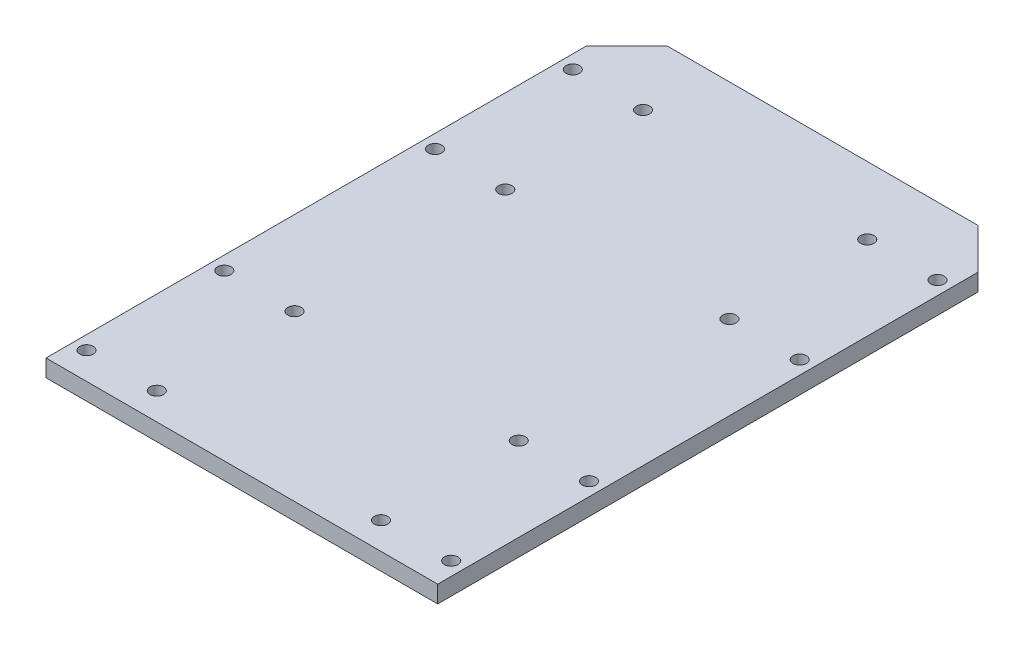
ISO-10303-21;
HEADER;
FILE_DESCRIPTION(('STEP AP214'),'2;1');
FILE_NAME('part.step','',(''),(''),'','','');
FILE_SCHEMA(('AUTOMOTIVE_DESIGN { 1 0 10303 214 1 1 1 1 }'));
ENDSEC;
DATA;
#1=APPLICATION_CONTEXT('core data for automotive mechanical design processes');
#2=APPLICATION_PROTOCOL_DEFINITION('international standard','automotive_design',2000,#1);
#3=PRODUCT_CONTEXT('',#1,'mechanical');
#4=PRODUCT('Part','Part','',(#3));
#5=PRODUCT_RELATED_PRODUCT_CATEGORY('part','',(#4));
#6=PRODUCT_DEFINITION_FORMATION('','',#4);
#7=PRODUCT_DEFINITION_CONTEXT('part definition',#1,'design');
#8=PRODUCT_DEFINITION('design','',#6,#7);
#9=PRODUCT_DEFINITION_SHAPE('','',#8);
#10=(LENGTH_UNIT() NAMED_UNIT(*) SI_UNIT(.MILLI.,.METRE.));
#11=(NAMED_UNIT(*) PLANE_ANGLE_UNIT() SI_UNIT($,.RADIAN.));
#12=(NAMED_UNIT(*) SI_UNIT($,.STERADIAN.) SOLID_ANGLE_UNIT());
#13=UNCERTAINTY_MEASURE_WITH_UNIT(LENGTH_MEASURE(1.E-05),#10,'distance_accuracy_value','');
#14=(GEOMETRIC_REPRESENTATION_CONTEXT(3) GLOBAL_UNCERTAINTY_ASSIGNED_CONTEXT((#13)) GLOBAL_UNIT_ASSIGNED_CONTEXT((#10,
#11,#12)) REPRESENTATION_CONTEXT('',''));
#15=CARTESIAN_POINT('',(0.,0.,0.));
#16=DIRECTION('',(0.,0.,1.));
#17=DIRECTION('',(1.,0.,0.));
#18=AXIS2_PLACEMENT_3D('',#15,#16,#17);
#19=CARTESIAN_POINT('',(-145.,6.35,0.));
#20=DIRECTION('',(-1.,0.,0.));
#21=DIRECTION('',(0.,0.,1.));
#22=AXIS2_PLACEMENT_3D('',#19,#20,#21);
#23=PLANE('',#22);
#24=DIRECTION('',(0.,0.,-1.));
#25=VECTOR('',#24,1.);
#26=CARTESIAN_POINT('',(-145.,0.,0.));
#27=LINE('',#26,#25);
#28=CARTESIAN_POINT('',(-145.,0.,0.));
#29=VERTEX_POINT('',#28);
#30=CARTESIAN_POINT('',(-145.,0.,-200.));
#31=VERTEX_POINT('',#30);
#32=EDGE_CURVE('E193',#29,#31,#27,.T.);
#33=ORIENTED_EDGE('',*,*,#32,.F.);
#34=DIRECTION('',(0.,-1.,0.));
#35=VECTOR('',#34,1.);
#36=CARTESIAN_POINT('',(-145.,6.35,0.));
#37=LINE('',#36,#35);
#38=CARTESIAN_POINT('',(-145.,6.35,0.));
#39=VERTEX_POINT('',#38);
#40=EDGE_CURVE('E11',#39,#29,#37,.T.);
#41=ORIENTED_EDGE('',*,*,#40,.F.);
#42=DIRECTION('',(0.,0.,-1.));
#43=VECTOR('',#42,1.);
#44=CARTESIAN_POINT('',(-145.,6.35,0.));
#45=LINE('',#44,#43);
#46=CARTESIAN_POINT('',(-145.,6.35,-200.));
#47=VERTEX_POINT('',#46);
#48=EDGE_CURVE('E574',#39,#47,#45,.T.);
#49=ORIENTED_EDGE('',*,*,#48,.T.);
#50=DIRECTION('',(0.,-1.,0.));
#51=VECTOR('',#50,1.);
#52=CARTESIAN_POINT('',(-145.,6.35,-200.));
#53=LINE('',#52,#51);
#54=EDGE_CURVE('E59',#47,#31,#53,.T.);
#55=ORIENTED_EDGE('',*,*,#54,.T.);
#56=EDGE_LOOP('',(#33,#41,#49,#55));
#57=FACE_BOUND('',#56,.T.);
#58=ADVANCED_FACE('F41',(#57),#23,.T.);
#59=CARTESIAN_POINT('',(0.,6.35,0.));
#60=DIRECTION('',(0.,0.,1.));
#61=DIRECTION('',(1.,0.,0.));
#62=AXIS2_PLACEMENT_3D('',#59,#60,#61);
#63=PLANE('',#62);
#64=DIRECTION('',(-1.,0.,0.));
#65=VECTOR('',#64,1.);
#66=CARTESIAN_POINT('',(0.,0.,0.));
#67=LINE('',#66,#65);
#68=CARTESIAN_POINT('',(0.,0.,0.));
#69=VERTEX_POINT('',#68);
#70=EDGE_CURVE('E196',#69,#29,#67,.T.);
#71=ORIENTED_EDGE('',*,*,#70,.F.);
#72=DIRECTION('',(0.,-1.,0.));
#73=VECTOR('',#72,1.);
#74=CARTESIAN_POINT('',(0.,6.35,0.));
#75=LINE('',#74,#73);
#76=CARTESIAN_POINT('',(0.,6.35,0.));
#77=VERTEX_POINT('',#76);
#78=EDGE_CURVE('E51',#77,#69,#75,.T.);
#79=ORIENTED_EDGE('',*,*,#78,.F.);
#80=DIRECTION('',(-1.,0.,0.));
#81=VECTOR('',#80,1.);
#82=CARTESIAN_POINT('',(0.,6.35,0.));
#83=LINE('',#82,#81);
#84=EDGE_CURVE('E246',#77,#39,#83,.T.);
#85=ORIENTED_EDGE('',*,*,#84,.T.);
#86=ORIENTED_EDGE('',*,*,#40,.T.);
#87=EDGE_LOOP('',(#71,#79,#85,#86));
#88=FACE_BOUND('',#87,.T.);
#89=ADVANCED_FACE('F245',(#88),#63,.T.);
#90=CARTESIAN_POINT('',(0.,6.35,0.));
#91=DIRECTION('',(-1.,0.,0.));
#92=DIRECTION('',(0.,0.,1.));
#93=AXIS2_PLACEMENT_3D('',#90,#91,#92);
#94=PLANE('',#93);
#95=DIRECTION('',(0.,0.,-1.));
#96=VECTOR('',#95,1.);
#97=CARTESIAN_POINT('',(0.,0.,0.));
#98=LINE('',#97,#96);
#99=CARTESIAN_POINT('',(0.,0.,-200.));
#100=VERTEX_POINT('',#99);
#101=EDGE_CURVE('E200',#69,#100,#98,.T.);
#102=ORIENTED_EDGE('',*,*,#101,.T.);
#103=DIRECTION('',(0.,-1.,0.));
#104=VECTOR('',#103,1.);
#105=CARTESIAN_POINT('',(0.,6.35,-200.));
#106=LINE('',#105,#104);
#107=CARTESIAN_POINT('',(0.,6.35,-200.));
#108=VERTEX_POINT('',#107);
#109=EDGE_CURVE('E107',#108,#100,#106,.T.);
#110=ORIENTED_EDGE('',*,*,#109,.F.);
#111=DIRECTION('',(0.,0.,-1.));
#112=VECTOR('',#111,1.);
#113=CARTESIAN_POINT('',(0.,6.35,0.));
#114=LINE('',#113,#112);
#115=EDGE_CURVE('E117',#77,#108,#114,.T.);
#116=ORIENTED_EDGE('',*,*,#115,.F.);
#117=ORIENTED_EDGE('',*,*,#78,.T.);
#118=EDGE_LOOP('',(#102,#110,#116,#117));
#119=FACE_BOUND('',#118,.T.);
#120=ADVANCED_FACE('F238',(#119),#94,.F.);
#121=CARTESIAN_POINT('',(100.,6.35,-100.000000000001));
#122=DIRECTION('',(0.707106781186542,0.,-0.707106781186552));
#123=DIRECTION('',(-0.707106781186552,0.,-0.707106781186543));
#124=AXIS2_PLACEMENT_3D('',#121,#122,#123);
#125=PLANE('',#124);
#126=DIRECTION('',(0.707106781186552,0.,0.707106781186543));
#127=VECTOR('',#126,1.);
#128=CARTESIAN_POINT('',(100.,0.,-100.000000000001));
#129=LINE('',#128,#127);
#130=CARTESIAN_POINT('',(-15.0000000000002,0.,-215.));
#131=VERTEX_POINT('',#130);
#132=EDGE_CURVE('E102',#131,#100,#129,.T.);
#133=ORIENTED_EDGE('',*,*,#132,.F.);
#134=DIRECTION('',(0.,-1.,0.));
#135=VECTOR('',#134,1.);
#136=CARTESIAN_POINT('',(-15.0000000000002,6.35,-215.));
#137=LINE('',#136,#135);
#138=CARTESIAN_POINT('',(-15.0000000000002,6.35,-215.));
#139=VERTEX_POINT('',#138);
#140=EDGE_CURVE('E97',#139,#131,#137,.T.);
#141=ORIENTED_EDGE('',*,*,#140,.F.);
#142=DIRECTION('',(0.707106781186552,0.,0.707106781186543));
#143=VECTOR('',#142,1.);
#144=CARTESIAN_POINT('',(100.,6.35,-100.000000000001));
#145=LINE('',#144,#143);
#146=EDGE_CURVE('E100',#139,#108,#145,.T.);
#147=ORIENTED_EDGE('',*,*,#146,.T.);
#148=ORIENTED_EDGE('',*,*,#109,.T.);
#149=EDGE_LOOP('',(#133,#141,#147,#148));
#150=FACE_BOUND('',#149,.T.);
#151=ADVANCED_FACE('F99',(#150),#125,.T.);
#152=CARTESIAN_POINT('',(-1.55672576278963E-13,6.35,-215.));
#153=DIRECTION('',(0.,0.,-1.));
#154=DIRECTION('',(-1.,0.,0.));
#155=AXIS2_PLACEMENT_3D('',#152,#153,#154);
#156=PLANE('',#155);
#157=DIRECTION('',(1.,0.,0.));
#158=VECTOR('',#157,1.);
#159=CARTESIAN_POINT('',(-1.55672576278963E-13,0.,-215.));
#160=LINE('',#159,#158);
#161=CARTESIAN_POINT('',(-130.,0.,-215.));
#162=VERTEX_POINT('',#161);
#163=EDGE_CURVE('E206',#162,#131,#160,.T.);
#164=ORIENTED_EDGE('',*,*,#163,.F.);
#165=DIRECTION('',(0.,-1.,0.));
#166=VECTOR('',#165,1.);
#167=CARTESIAN_POINT('',(-130.,6.35,-215.));
#168=LINE('',#167,#166);
#169=CARTESIAN_POINT('',(-130.,6.35,-215.));
#170=VERTEX_POINT('',#169);
#171=EDGE_CURVE('E78',#170,#162,#168,.T.);
#172=ORIENTED_EDGE('',*,*,#171,.F.);
#173=DIRECTION('',(1.,0.,0.));
#174=VECTOR('',#173,1.);
#175=CARTESIAN_POINT('',(-1.55672576278963E-13,6.35,-215.));
#176=LINE('',#175,#174);
#177=EDGE_CURVE('E114',#170,#139,#176,.T.);
#178=ORIENTED_EDGE('',*,*,#177,.T.);
#179=ORIENTED_EDGE('',*,*,#140,.T.);
#180=EDGE_LOOP('',(#164,#172,#178,#179));
#181=FACE_BOUND('',#180,.T.);
#182=ADVANCED_FACE('F121',(#181),#156,.T.);
#183=CARTESIAN_POINT('',(-114.,6.35,-61.));
#184=DIRECTION('',(0.,-1.,0.));
#185=DIRECTION('',(0.,0.,-1.));
#186=AXIS2_PLACEMENT_3D('',#183,#184,#185);
#187=CYLINDRICAL_SURFACE('',#186,2.5);
#188=CARTESIAN_POINT('',(-114.,6.35,-61.));
#189=DIRECTION('',(0.,1.,0.));
#190=DIRECTION('',(0.,0.,1.));
#191=AXIS2_PLACEMENT_3D('',#188,#189,#190);
#192=CIRCLE('',#191,2.5);
#193=CARTESIAN_POINT('',(-114.,6.35,-58.5));
#194=VERTEX_POINT('',#193);
#195=EDGE_CURVE('E137',#194,#194,#192,.F.);
#196=ORIENTED_EDGE('',*,*,#195,.F.);
#197=EDGE_LOOP('',(#196));
#198=FACE_BOUND('',#197,.T.);
#199=CARTESIAN_POINT('',(-114.,0.,-61.));
#200=DIRECTION('',(0.,1.,0.));
#201=DIRECTION('',(0.,0.,1.));
#202=AXIS2_PLACEMENT_3D('',#199,#200,#201);
#203=CIRCLE('',#202,2.5);
#204=CARTESIAN_POINT('',(-114.,0.,-58.5));
#205=VERTEX_POINT('',#204);
#206=EDGE_CURVE('E221',#205,#205,#203,.F.);
#207=ORIENTED_EDGE('',*,*,#206,.T.);
#208=EDGE_LOOP('',(#207));
#209=FACE_BOUND('',#208,.T.);
#210=ADVANCED_FACE('F362',(#198,#209),#187,.F.);
#211=CARTESIAN_POINT('',(-31.,6.35,-139.));
#212=DIRECTION('',(0.,-1.,0.));
#213=DIRECTION('',(0.,0.,-1.));
#214=AXIS2_PLACEMENT_3D('',#211,#212,#213);
#215=CYLINDRICAL_SURFACE('',#214,2.5);
#216=CARTESIAN_POINT('',(-31.,6.35,-139.));
#217=DIRECTION('',(0.,1.,0.));
#218=DIRECTION('',(0.,0.,1.));
#219=AXIS2_PLACEMENT_3D('',#216,#217,#218);
#220=CIRCLE('',#219,2.5);
#221=CARTESIAN_POINT('',(-31.,6.35,-136.5));
#222=VERTEX_POINT('',#221);
#223=EDGE_CURVE('E133',#222,#222,#220,.F.);
#224=ORIENTED_EDGE('',*,*,#223,.F.);
#225=EDGE_LOOP('',(#224));
#226=FACE_BOUND('',#225,.T.);
#227=CARTESIAN_POINT('',(-31.,0.,-139.));
#228=DIRECTION('',(0.,1.,0.));
#229=DIRECTION('',(0.,0.,1.));
#230=AXIS2_PLACEMENT_3D('',#227,#228,#229);
#231=CIRCLE('',#230,2.5);
#232=CARTESIAN_POINT('',(-31.,0.,-136.5));
#233=VERTEX_POINT('',#232);
#234=EDGE_CURVE('E217',#233,#233,#231,.F.);
#235=ORIENTED_EDGE('',*,*,#234,.T.);
#236=EDGE_LOOP('',(#235));
#237=FACE_BOUND('',#236,.T.);
#238=ADVANCED_FACE('F259',(#226,#237),#215,.F.);
#239=CARTESIAN_POINT('',(-5.,6.35,-190.));
#240=DIRECTION('',(0.,-1.,0.));
#241=DIRECTION('',(0.,0.,-1.));
#242=AXIS2_PLACEMENT_3D('',#239,#240,#241);
#243=CYLINDRICAL_SURFACE('',#242,2.5);
#244=CARTESIAN_POINT('',(-5.,6.35,-190.));
#245=DIRECTION('',(0.,1.,0.));
#246=DIRECTION('',(0.,0.,1.));
#247=AXIS2_PLACEMENT_3D('',#244,#245,#246);
#248=CIRCLE('',#247,2.5);
#249=CARTESIAN_POINT('',(-5.,6.35,-187.5));
#250=VERTEX_POINT('',#249);
#251=EDGE_CURVE('E126',#250,#250,#248,.F.);
#252=ORIENTED_EDGE('',*,*,#251,.F.);
#253=EDGE_LOOP('',(#252));
#254=FACE_BOUND('',#253,.T.);
#255=CARTESIAN_POINT('',(-5.,0.,-190.));
#256=DIRECTION('',(0.,1.,0.));
#257=DIRECTION('',(0.,0.,1.));
#258=AXIS2_PLACEMENT_3D('',#255,#256,#257);
#259=CIRCLE('',#258,2.5);
#260=CARTESIAN_POINT('',(-5.,0.,-187.5));
#261=VERTEX_POINT('',#260);
#262=EDGE_CURVE('E213',#261,#261,#259,.F.);
#263=ORIENTED_EDGE('',*,*,#262,.T.);
#264=EDGE_LOOP('',(#263));
#265=FACE_BOUND('',#264,.T.);
#266=ADVANCED_FACE('F250',(#254,#265),#243,.F.);
#267=CARTESIAN_POINT('',(-172.499999999999,6.35,-172.500000000001));
#268=DIRECTION('',(-0.707106781186544,0.,-0.707106781186551));
#269=DIRECTION('',(-0.707106781186551,0.,0.707106781186544));
#270=AXIS2_PLACEMENT_3D('',#267,#268,#269);
#271=PLANE('',#270);
#272=DIRECTION('',(0.707106781186551,0.,-0.707106781186544));
#273=VECTOR('',#272,1.);
#274=CARTESIAN_POINT('',(-172.499999999999,0.,-172.500000000001));
#275=LINE('',#274,#273);
#276=EDGE_CURVE('E209',#31,#162,#275,.T.);
#277=ORIENTED_EDGE('',*,*,#276,.F.);
#278=ORIENTED_EDGE('',*,*,#54,.F.);
#279=DIRECTION('',(0.707106781186551,0.,-0.707106781186544));
#280=VECTOR('',#279,1.);
#281=CARTESIAN_POINT('',(-172.499999999999,6.35,-172.500000000001));
#282=LINE('',#281,#280);
#283=EDGE_CURVE('E123',#47,#170,#282,.T.);
#284=ORIENTED_EDGE('',*,*,#283,.T.);
#285=ORIENTED_EDGE('',*,*,#171,.T.);
#286=EDGE_LOOP('',(#277,#278,#284,#285));
#287=FACE_BOUND('',#286,.T.);
#288=ADVANCED_FACE('F247',(#287),#271,.T.);
#289=CARTESIAN_POINT('',(-140.,6.35,-190.));
#290=DIRECTION('',(0.,-1.,0.));
#291=DIRECTION('',(0.,0.,-1.));
#292=AXIS2_PLACEMENT_3D('',#289,#290,#291);
#293=CYLINDRICAL_SURFACE('',#292,2.5);
#294=CARTESIAN_POINT('',(-140.,6.35,-190.));
#295=DIRECTION('',(0.,1.,0.));
#296=DIRECTION('',(0.,0.,1.));
#297=AXIS2_PLACEMENT_3D('',#294,#295,#296);
#298=CIRCLE('',#297,2.5);
#299=CARTESIAN_POINT('',(-140.,6.35,-187.5));
#300=VERTEX_POINT('',#299);
#301=EDGE_CURVE('E572',#300,#300,#298,.T.);
#302=ORIENTED_EDGE('',*,*,#301,.T.);
#303=EDGE_LOOP('',(#302));
#304=FACE_BOUND('',#303,.T.);
#305=CARTESIAN_POINT('',(-140.,0.,-190.));
#306=DIRECTION('',(0.,1.,0.));
#307=DIRECTION('',(0.,0.,1.));
#308=AXIS2_PLACEMENT_3D('',#305,#306,#307);
#309=CIRCLE('',#308,2.5);
#310=CARTESIAN_POINT('',(-140.,0.,-187.5));
#311=VERTEX_POINT('',#310);
#312=EDGE_CURVE('E189',#311,#311,#309,.T.);
#313=ORIENTED_EDGE('',*,*,#312,.F.);
#314=EDGE_LOOP('',(#313));
#315=FACE_BOUND('',#314,.T.);
#316=ADVANCED_FACE('F249',(#304,#315),#293,.F.);
#317=CARTESIAN_POINT('',(-114.,6.35,-190.));
#318=DIRECTION('',(0.,-1.,0.));
#319=DIRECTION('',(0.,0.,-1.));
#320=AXIS2_PLACEMENT_3D('',#317,#318,#319);
#321=CYLINDRICAL_SURFACE('',#320,2.5);
#322=CARTESIAN_POINT('',(-114.,6.35,-190.));
#323=DIRECTION('',(0.,1.,0.));
#324=DIRECTION('',(0.,0.,1.));
#325=AXIS2_PLACEMENT_3D('',#322,#323,#324);
#326=CIRCLE('',#325,2.5);
#327=CARTESIAN_POINT('',(-114.,6.35,-187.5));
#328=VERTEX_POINT('',#327);
#329=EDGE_CURVE('E569',#328,#328,#326,.T.);
#330=ORIENTED_EDGE('',*,*,#329,.T.);
#331=EDGE_LOOP('',(#330));
#332=FACE_BOUND('',#331,.T.);
#333=CARTESIAN_POINT('',(-114.,0.,-190.));
#334=DIRECTION('',(0.,1.,0.));
#335=DIRECTION('',(0.,0.,1.));
#336=AXIS2_PLACEMENT_3D('',#333,#334,#335);
#337=CIRCLE('',#336,2.5);
#338=CARTESIAN_POINT('',(-114.,0.,-187.5));
#339=VERTEX_POINT('',#338);
#340=EDGE_CURVE('E185',#339,#339,#337,.T.);
#341=ORIENTED_EDGE('',*,*,#340,.F.);
#342=EDGE_LOOP('',(#341));
#343=FACE_BOUND('',#342,.T.);
#344=ADVANCED_FACE('F256',(#332,#343),#321,.F.);
#345=CARTESIAN_POINT('',(-140.,6.35,-139.));
#346=DIRECTION('',(0.,-1.,0.));
#347=DIRECTION('',(0.,0.,-1.));
#348=AXIS2_PLACEMENT_3D('',#345,#346,#347);
#349=CYLINDRICAL_SURFACE('',#348,2.5);
#350=CARTESIAN_POINT('',(-140.,6.35,-139.));
#351=DIRECTION('',(0.,1.,0.));
#352=DIRECTION('',(0.,0.,1.));
#353=AXIS2_PLACEMENT_3D('',#350,#351,#352);
#354=CIRCLE('',#353,2.5);
#355=CARTESIAN_POINT('',(-140.,6.35,-136.5));
#356=VERTEX_POINT('',#355);
#357=EDGE_CURVE('E565',#356,#356,#354,.T.);
#358=ORIENTED_EDGE('',*,*,#357,.T.);
#359=EDGE_LOOP('',(#358));
#360=FACE_BOUND('',#359,.T.);
#361=CARTESIAN_POINT('',(-140.,0.,-139.));
#362=DIRECTION('',(0.,1.,0.));
#363=DIRECTION('',(0.,0.,1.));
#364=AXIS2_PLACEMENT_3D('',#361,#362,#363);
#365=CIRCLE('',#364,2.5);
#366=CARTESIAN_POINT('',(-140.,0.,-136.5));
#367=VERTEX_POINT('',#366);
#368=EDGE_CURVE('E181',#367,#367,#365,.T.);
#369=ORIENTED_EDGE('',*,*,#368,.F.);
#370=EDGE_LOOP('',(#369));
#371=FACE_BOUND('',#370,.T.);
#372=ADVANCED_FACE('F273',(#360,#371),#349,.F.);
#373=CARTESIAN_POINT('',(-114.,6.35,-139.));
#374=DIRECTION('',(0.,-1.,0.));
#375=DIRECTION('',(0.,0.,-1.));
#376=AXIS2_PLACEMENT_3D('',#373,#374,#375);
#377=CYLINDRICAL_SURFACE('',#376,2.5);
#378=CARTESIAN_POINT('',(-114.,6.35,-139.));
#379=DIRECTION('',(0.,1.,0.));
#380=DIRECTION('',(0.,0.,1.));
#381=AXIS2_PLACEMENT_3D('',#378,#379,#380);
#382=CIRCLE('',#381,2.5);
#383=CARTESIAN_POINT('',(-114.,6.35,-136.5));
#384=VERTEX_POINT('',#383);
#385=EDGE_CURVE('E561',#384,#384,#382,.T.);
#386=ORIENTED_EDGE('',*,*,#385,.T.);
#387=EDGE_LOOP('',(#386));
#388=FACE_BOUND('',#387,.T.);
#389=CARTESIAN_POINT('',(-114.,0.,-139.));
#390=DIRECTION('',(0.,1.,0.));
#391=DIRECTION('',(0.,0.,1.));
#392=AXIS2_PLACEMENT_3D('',#389,#390,#391);
#393=CIRCLE('',#392,2.5);
#394=CARTESIAN_POINT('',(-114.,0.,-136.5));
#395=VERTEX_POINT('',#394);
#396=EDGE_CURVE('E177',#395,#395,#393,.T.);
#397=ORIENTED_EDGE('',*,*,#396,.F.);
#398=EDGE_LOOP('',(#397));
#399=FACE_BOUND('',#398,.T.);
#400=ADVANCED_FACE('F277',(#388,#399),#377,.F.);
#401=CARTESIAN_POINT('',(-31.,6.35,-190.));
#402=DIRECTION('',(0.,-1.,0.));
#403=DIRECTION('',(0.,0.,-1.));
#404=AXIS2_PLACEMENT_3D('',#401,#402,#403);
#405=CYLINDRICAL_SURFACE('',#404,2.5);
#406=CARTESIAN_POINT('',(-31.,6.35,-190.));
#407=DIRECTION('',(0.,1.,0.));
#408=DIRECTION('',(0.,0.,1.));
#409=AXIS2_PLACEMENT_3D('',#406,#407,#408);
#410=CIRCLE('',#409,2.5);
#411=CARTESIAN_POINT('',(-31.,6.35,-187.5));
#412=VERTEX_POINT('',#411);
#413=EDGE_CURVE('E557',#412,#412,#410,.F.);
#414=ORIENTED_EDGE('',*,*,#413,.F.);
#415=EDGE_LOOP('',(#414));
#416=FACE_BOUND('',#415,.T.);
#417=CARTESIAN_POINT('',(-31.,0.,-190.));
#418=DIRECTION('',(0.,1.,0.));
#419=DIRECTION('',(0.,0.,1.));
#420=AXIS2_PLACEMENT_3D('',#417,#418,#419);
#421=CIRCLE('',#420,2.5);
#422=CARTESIAN_POINT('',(-31.,0.,-187.5));
#423=VERTEX_POINT('',#422);
#424=EDGE_CURVE('E173',#423,#423,#421,.F.);
#425=ORIENTED_EDGE('',*,*,#424,.T.);
#426=EDGE_LOOP('',(#425));
#427=FACE_BOUND('',#426,.T.);
#428=ADVANCED_FACE('F281',(#416,#427),#405,.F.);
#429=CARTESIAN_POINT('',(-5.,6.35,-139.));
#430=DIRECTION('',(0.,-1.,0.));
#431=DIRECTION('',(0.,0.,-1.));
#432=AXIS2_PLACEMENT_3D('',#429,#430,#431);
#433=CYLINDRICAL_SURFACE('',#432,2.5);
#434=CARTESIAN_POINT('',(-5.,6.35,-139.));
#435=DIRECTION('',(0.,1.,0.));
#436=DIRECTION('',(0.,0.,1.));
#437=AXIS2_PLACEMENT_3D('',#434,#435,#436);
#438=CIRCLE('',#437,2.5);
#439=CARTESIAN_POINT('',(-5.,6.35,-136.5));
#440=VERTEX_POINT('',#439);
#441=EDGE_CURVE('E553',#440,#440,#438,.F.);
#442=ORIENTED_EDGE('',*,*,#441,.F.);
#443=EDGE_LOOP('',(#442));
#444=FACE_BOUND('',#443,.T.);
#445=CARTESIAN_POINT('',(-5.,0.,-139.));
#446=DIRECTION('',(0.,1.,0.));
#447=DIRECTION('',(0.,0.,1.));
#448=AXIS2_PLACEMENT_3D('',#445,#446,#447);
#449=CIRCLE('',#448,2.5);
#450=CARTESIAN_POINT('',(-5.,0.,-136.5));
#451=VERTEX_POINT('',#450);
#452=EDGE_CURVE('E169',#451,#451,#449,.F.);
#453=ORIENTED_EDGE('',*,*,#452,.T.);
#454=EDGE_LOOP('',(#453));
#455=FACE_BOUND('',#454,.T.);
#456=ADVANCED_FACE('F285',(#444,#455),#433,.F.);
#457=CARTESIAN_POINT('',(-4.99999999999995,6.35,-10.0000000000001));
#458=DIRECTION('',(0.,-1.,0.));
#459=DIRECTION('',(0.,0.,-1.));
#460=AXIS2_PLACEMENT_3D('',#457,#458,#459);
#461=CYLINDRICAL_SURFACE('',#460,2.5);
#462=CARTESIAN_POINT('',(-4.99999999999995,6.35,-10.0000000000001));
#463=DIRECTION('',(0.,1.,0.));
#464=DIRECTION('',(0.,0.,1.));
#465=AXIS2_PLACEMENT_3D('',#462,#463,#464);
#466=CIRCLE('',#465,2.5);
#467=CARTESIAN_POINT('',(-4.99999999999995,6.35,-7.50000000000007));
#468=VERTEX_POINT('',#467);
#469=EDGE_CURVE('E549',#468,#468,#466,.T.);
#470=ORIENTED_EDGE('',*,*,#469,.T.);
#471=EDGE_LOOP('',(#470));
#472=FACE_BOUND('',#471,.T.);
#473=CARTESIAN_POINT('',(-4.99999999999995,0.,-10.0000000000001));
#474=DIRECTION('',(0.,1.,0.));
#475=DIRECTION('',(0.,0.,1.));
#476=AXIS2_PLACEMENT_3D('',#473,#474,#475);
#477=CIRCLE('',#476,2.5);
#478=CARTESIAN_POINT('',(-4.99999999999995,0.,-7.50000000000007));
#479=VERTEX_POINT('',#478);
#480=EDGE_CURVE('E165',#479,#479,#477,.T.);
#481=ORIENTED_EDGE('',*,*,#480,.F.);
#482=EDGE_LOOP('',(#481));
#483=FACE_BOUND('',#482,.T.);
#484=ADVANCED_FACE('F289',(#472,#483),#461,.F.);
#485=CARTESIAN_POINT('',(-5.,6.35,-61.0000000000001));
#486=DIRECTION('',(0.,-1.,0.));
#487=DIRECTION('',(0.,0.,-1.));
#488=AXIS2_PLACEMENT_3D('',#485,#486,#487);
#489=CYLINDRICAL_SURFACE('',#488,2.5);
#490=CARTESIAN_POINT('',(-5.,6.35,-61.0000000000001));
#491=DIRECTION('',(0.,1.,0.));
#492=DIRECTION('',(0.,0.,1.));
#493=AXIS2_PLACEMENT_3D('',#490,#491,#492);
#494=CIRCLE('',#493,2.5);
#495=CARTESIAN_POINT('',(-5.,6.35,-58.5000000000001));
#496=VERTEX_POINT('',#495);
#497=EDGE_CURVE('E545',#496,#496,#494,.T.);
#498=ORIENTED_EDGE('',*,*,#497,.T.);
#499=EDGE_LOOP('',(#498));
#500=FACE_BOUND('',#499,.T.);
#501=CARTESIAN_POINT('',(-5.,0.,-61.0000000000001));
#502=DIRECTION('',(0.,1.,0.));
#503=DIRECTION('',(0.,0.,1.));
#504=AXIS2_PLACEMENT_3D('',#501,#502,#503);
#505=CIRCLE('',#504,2.5);
#506=CARTESIAN_POINT('',(-5.,0.,-58.5000000000001));
#507=VERTEX_POINT('',#506);
#508=EDGE_CURVE('E161',#507,#507,#505,.T.);
#509=ORIENTED_EDGE('',*,*,#508,.F.);
#510=EDGE_LOOP('',(#509));
#511=FACE_BOUND('',#510,.T.);
#512=ADVANCED_FACE('F293',(#500,#511),#489,.F.);
#513=CARTESIAN_POINT('',(-31.,6.35,-61.));
#514=DIRECTION('',(0.,-1.,0.));
#515=DIRECTION('',(0.,0.,-1.));
#516=AXIS2_PLACEMENT_3D('',#513,#514,#515);
#517=CYLINDRICAL_SURFACE('',#516,2.5);
#518=CARTESIAN_POINT('',(-31.,6.35,-61.));
#519=DIRECTION('',(0.,1.,0.));
#520=DIRECTION('',(0.,0.,1.));
#521=AXIS2_PLACEMENT_3D('',#518,#519,#520);
#522=CIRCLE('',#521,2.5);
#523=CARTESIAN_POINT('',(-31.,6.35,-58.5));
#524=VERTEX_POINT('',#523);
#525=EDGE_CURVE('E541',#524,#524,#522,.T.);
#526=ORIENTED_EDGE('',*,*,#525,.T.);
#527=EDGE_LOOP('',(#526));
#528=FACE_BOUND('',#527,.T.);
#529=CARTESIAN_POINT('',(-31.,0.,-61.));
#530=DIRECTION('',(0.,1.,0.));
#531=DIRECTION('',(0.,0.,1.));
#532=AXIS2_PLACEMENT_3D('',#529,#530,#531);
#533=CIRCLE('',#532,2.5);
#534=CARTESIAN_POINT('',(-31.,0.,-58.5));
#535=VERTEX_POINT('',#534);
#536=EDGE_CURVE('E157',#535,#535,#533,.T.);
#537=ORIENTED_EDGE('',*,*,#536,.F.);
#538=EDGE_LOOP('',(#537));
#539=FACE_BOUND('',#538,.T.);
#540=ADVANCED_FACE('F297',(#528,#539),#517,.F.);
#541=CARTESIAN_POINT('',(-31.,6.35,-10.0000000000001));
#542=DIRECTION('',(0.,-1.,0.));
#543=DIRECTION('',(0.,0.,-1.));
#544=AXIS2_PLACEMENT_3D('',#541,#542,#543);
#545=CYLINDRICAL_SURFACE('',#544,2.5);
#546=CARTESIAN_POINT('',(-31.,6.35,-10.0000000000001));
#547=DIRECTION('',(0.,1.,0.));
#548=DIRECTION('',(0.,0.,1.));
#549=AXIS2_PLACEMENT_3D('',#546,#547,#548);
#550=CIRCLE('',#549,2.5);
#551=CARTESIAN_POINT('',(-31.,6.35,-7.50000000000007));
#552=VERTEX_POINT('',#551);
#553=EDGE_CURVE('E537',#552,#552,#550,.T.);
#554=ORIENTED_EDGE('',*,*,#553,.T.);
#555=EDGE_LOOP('',(#554));
#556=FACE_BOUND('',#555,.T.);
#557=CARTESIAN_POINT('',(-31.,0.,-10.0000000000001));
#558=DIRECTION('',(0.,1.,0.));
#559=DIRECTION('',(0.,0.,1.));
#560=AXIS2_PLACEMENT_3D('',#557,#558,#559);
#561=CIRCLE('',#560,2.5);
#562=CARTESIAN_POINT('',(-31.,0.,-7.50000000000007));
#563=VERTEX_POINT('',#562);
#564=EDGE_CURVE('E153',#563,#563,#561,.T.);
#565=ORIENTED_EDGE('',*,*,#564,.F.);
#566=EDGE_LOOP('',(#565));
#567=FACE_BOUND('',#566,.T.);
#568=ADVANCED_FACE('F301',(#556,#567),#545,.F.);
#569=CARTESIAN_POINT('',(-114.,6.35,-10.));
#570=DIRECTION('',(0.,-1.,0.));
#571=DIRECTION('',(0.,0.,-1.));
#572=AXIS2_PLACEMENT_3D('',#569,#570,#571);
#573=CYLINDRICAL_SURFACE('',#572,2.50000000000001);
#574=CARTESIAN_POINT('',(-114.,6.35,-10.));
#575=DIRECTION('',(0.,1.,0.));
#576=DIRECTION('',(0.,0.,1.));
#577=AXIS2_PLACEMENT_3D('',#574,#575,#576);
#578=CIRCLE('',#577,2.50000000000001);
#579=CARTESIAN_POINT('',(-114.,6.35,-7.5));
#580=VERTEX_POINT('',#579);
#581=EDGE_CURVE('E316',#580,#580,#578,.F.);
#582=ORIENTED_EDGE('',*,*,#581,.F.);
#583=EDGE_LOOP('',(#582));
#584=FACE_BOUND('',#583,.T.);
#585=CARTESIAN_POINT('',(-114.,0.,-10.));
#586=DIRECTION('',(0.,1.,0.));
#587=DIRECTION('',(0.,0.,1.));
#588=AXIS2_PLACEMENT_3D('',#585,#586,#587);
#589=CIRCLE('',#588,2.50000000000001);
#590=CARTESIAN_POINT('',(-114.,0.,-7.5));
#591=VERTEX_POINT('',#590);
#592=EDGE_CURVE('E149',#591,#591,#589,.F.);
#593=ORIENTED_EDGE('',*,*,#592,.T.);
#594=EDGE_LOOP('',(#593));
#595=FACE_BOUND('',#594,.T.);
#596=ADVANCED_FACE('F304',(#584,#595),#573,.F.);
#597=CARTESIAN_POINT('',(-140.,6.35,-10.));
#598=DIRECTION('',(0.,-1.,0.));
#599=DIRECTION('',(0.,0.,-1.));
#600=AXIS2_PLACEMENT_3D('',#597,#598,#599);
#601=CYLINDRICAL_SURFACE('',#600,2.5);
#602=CARTESIAN_POINT('',(-140.,6.35,-10.));
#603=DIRECTION('',(0.,1.,0.));
#604=DIRECTION('',(0.,0.,1.));
#605=AXIS2_PLACEMENT_3D('',#602,#603,#604);
#606=CIRCLE('',#605,2.5);
#607=CARTESIAN_POINT('',(-140.,6.35,-7.50000000000001));
#608=VERTEX_POINT('',#607);
#609=EDGE_CURVE('E229',#608,#608,#606,.F.);
#610=ORIENTED_EDGE('',*,*,#609,.F.);
#611=EDGE_LOOP('',(#610));
#612=FACE_BOUND('',#611,.T.);
#613=CARTESIAN_POINT('',(-140.,0.,-10.));
#614=DIRECTION('',(0.,1.,0.));
#615=DIRECTION('',(0.,0.,1.));
#616=AXIS2_PLACEMENT_3D('',#613,#614,#615);
#617=CIRCLE('',#616,2.5);
#618=CARTESIAN_POINT('',(-140.,0.,-7.50000000000001));
#619=VERTEX_POINT('',#618);
#620=EDGE_CURVE('E145',#619,#619,#617,.F.);
#621=ORIENTED_EDGE('',*,*,#620,.T.);
#622=EDGE_LOOP('',(#621));
#623=FACE_BOUND('',#622,.T.);
#624=ADVANCED_FACE('F43',(#612,#623),#601,.F.);
#625=CARTESIAN_POINT('',(-140.,6.35,-61.));
#626=DIRECTION('',(0.,-1.,0.));
#627=DIRECTION('',(0.,0.,-1.));
#628=AXIS2_PLACEMENT_3D('',#625,#626,#627);
#629=CYLINDRICAL_SURFACE('',#628,2.5);
#630=CARTESIAN_POINT('',(-140.,6.35,-61.));
#631=DIRECTION('',(0.,1.,0.));
#632=DIRECTION('',(0.,0.,1.));
#633=AXIS2_PLACEMENT_3D('',#630,#631,#632);
#634=CIRCLE('',#633,2.5);
#635=CARTESIAN_POINT('',(-140.,6.35,-58.5));
#636=VERTEX_POINT('',#635);
#637=EDGE_CURVE('E141',#636,#636,#634,.F.);
#638=ORIENTED_EDGE('',*,*,#637,.F.);
#639=EDGE_LOOP('',(#638));
#640=FACE_BOUND('',#639,.T.);
#641=CARTESIAN_POINT('',(-140.,0.,-61.));
#642=DIRECTION('',(0.,1.,0.));
#643=DIRECTION('',(0.,0.,1.));
#644=AXIS2_PLACEMENT_3D('',#641,#642,#643);
#645=CIRCLE('',#644,2.5);
#646=CARTESIAN_POINT('',(-140.,0.,-58.5));
#647=VERTEX_POINT('',#646);
#648=EDGE_CURVE('E225',#647,#647,#645,.F.);
#649=ORIENTED_EDGE('',*,*,#648,.T.);
#650=EDGE_LOOP('',(#649));
#651=FACE_BOUND('',#650,.T.);
#652=ADVANCED_FACE('F311',(#640,#651),#629,.F.);
#653=CARTESIAN_POINT('',(0.,6.35,0.));
#654=DIRECTION('',(0.,1.,0.));
#655=DIRECTION('',(0.,0.,1.));
#656=AXIS2_PLACEMENT_3D('',#653,#654,#655);
#657=PLANE('',#656);
#658=ORIENTED_EDGE('',*,*,#609,.T.);
#659=EDGE_LOOP('',(#658));
#660=FACE_BOUND('',#659,.T.);
#661=ORIENTED_EDGE('',*,*,#581,.T.);
#662=EDGE_LOOP('',(#661));
#663=FACE_BOUND('',#662,.T.);
#664=ORIENTED_EDGE('',*,*,#553,.F.);
#665=EDGE_LOOP('',(#664));
#666=FACE_BOUND('',#665,.T.);
#667=ORIENTED_EDGE('',*,*,#525,.F.);
#668=EDGE_LOOP('',(#667));
#669=FACE_BOUND('',#668,.T.);
#670=ORIENTED_EDGE('',*,*,#497,.F.);
#671=EDGE_LOOP('',(#670));
#672=FACE_BOUND('',#671,.T.);
#673=ORIENTED_EDGE('',*,*,#469,.F.);
#674=EDGE_LOOP('',(#673));
#675=FACE_BOUND('',#674,.T.);
#676=ORIENTED_EDGE('',*,*,#441,.T.);
#677=EDGE_LOOP('',(#676));
#678=FACE_BOUND('',#677,.T.);
#679=ORIENTED_EDGE('',*,*,#413,.T.);
#680=EDGE_LOOP('',(#679));
#681=FACE_BOUND('',#680,.T.);
#682=ORIENTED_EDGE('',*,*,#385,.F.);
#683=EDGE_LOOP('',(#682));
#684=FACE_BOUND('',#683,.T.);
#685=ORIENTED_EDGE('',*,*,#357,.F.);
#686=EDGE_LOOP('',(#685));
#687=FACE_BOUND('',#686,.T.);
#688=ORIENTED_EDGE('',*,*,#329,.F.);
#689=EDGE_LOOP('',(#688));
#690=FACE_BOUND('',#689,.T.);
#691=ORIENTED_EDGE('',*,*,#301,.F.);
#692=EDGE_LOOP('',(#691));
#693=FACE_BOUND('',#692,.T.);
#694=ORIENTED_EDGE('',*,*,#48,.F.);
#695=ORIENTED_EDGE('',*,*,#84,.F.);
#696=ORIENTED_EDGE('',*,*,#115,.T.);
#697=ORIENTED_EDGE('',*,*,#146,.F.);
#698=ORIENTED_EDGE('',*,*,#177,.F.);
#699=ORIENTED_EDGE('',*,*,#283,.F.);
#700=EDGE_LOOP('',(#694,#695,#696,#697,#698,#699));
#701=FACE_BOUND('',#700,.T.);
#702=ORIENTED_EDGE('',*,*,#251,.T.);
#703=EDGE_LOOP('',(#702));
#704=FACE_BOUND('',#703,.T.);
#705=ORIENTED_EDGE('',*,*,#223,.T.);
#706=EDGE_LOOP('',(#705));
#707=FACE_BOUND('',#706,.T.);
#708=ORIENTED_EDGE('',*,*,#195,.T.);
#709=EDGE_LOOP('',(#708));
#710=FACE_BOUND('',#709,.T.);
#711=ORIENTED_EDGE('',*,*,#637,.T.);
#712=EDGE_LOOP('',(#711));
#713=FACE_BOUND('',#712,.T.);
#714=ADVANCED_FACE('F111',(#660,#663,#666,#669,#672,#675,#678,#681,#684,#687,#690,#693,#701,
#704,#707,#710,#713),#657,.T.);
#715=CARTESIAN_POINT('',(0.,0.,0.));
#716=DIRECTION('',(0.,1.,0.));
#717=DIRECTION('',(0.,0.,1.));
#718=AXIS2_PLACEMENT_3D('',#715,#716,#717);
#719=PLANE('',#718);
#720=ORIENTED_EDGE('',*,*,#620,.F.);
#721=EDGE_LOOP('',(#720));
#722=FACE_BOUND('',#721,.T.);
#723=ORIENTED_EDGE('',*,*,#592,.F.);
#724=EDGE_LOOP('',(#723));
#725=FACE_BOUND('',#724,.T.);
#726=ORIENTED_EDGE('',*,*,#564,.T.);
#727=EDGE_LOOP('',(#726));
#728=FACE_BOUND('',#727,.T.);
#729=ORIENTED_EDGE('',*,*,#536,.T.);
#730=EDGE_LOOP('',(#729));
#731=FACE_BOUND('',#730,.T.);
#732=ORIENTED_EDGE('',*,*,#508,.T.);
#733=EDGE_LOOP('',(#732));
#734=FACE_BOUND('',#733,.T.);
#735=ORIENTED_EDGE('',*,*,#480,.T.);
#736=EDGE_LOOP('',(#735));
#737=FACE_BOUND('',#736,.T.);
#738=ORIENTED_EDGE('',*,*,#452,.F.);
#739=EDGE_LOOP('',(#738));
#740=FACE_BOUND('',#739,.T.);
#741=ORIENTED_EDGE('',*,*,#424,.F.);
#742=EDGE_LOOP('',(#741));
#743=FACE_BOUND('',#742,.T.);
#744=ORIENTED_EDGE('',*,*,#396,.T.);
#745=EDGE_LOOP('',(#744));
#746=FACE_BOUND('',#745,.T.);
#747=ORIENTED_EDGE('',*,*,#368,.T.);
#748=EDGE_LOOP('',(#747));
#749=FACE_BOUND('',#748,.T.);
#750=ORIENTED_EDGE('',*,*,#340,.T.);
#751=EDGE_LOOP('',(#750));
#752=FACE_BOUND('',#751,.T.);
#753=ORIENTED_EDGE('',*,*,#312,.T.);
#754=EDGE_LOOP('',(#753));
#755=FACE_BOUND('',#754,.T.);
#756=ORIENTED_EDGE('',*,*,#32,.T.);
#757=ORIENTED_EDGE('',*,*,#276,.T.);
#758=ORIENTED_EDGE('',*,*,#163,.T.);
#759=ORIENTED_EDGE('',*,*,#132,.T.);
#760=ORIENTED_EDGE('',*,*,#101,.F.);
#761=ORIENTED_EDGE('',*,*,#70,.T.);
#762=EDGE_LOOP('',(#756,#757,#758,#759,#760,#761));
#763=FACE_BOUND('',#762,.T.);
#764=ORIENTED_EDGE('',*,*,#262,.F.);
#765=EDGE_LOOP('',(#764));
#766=FACE_BOUND('',#765,.T.);
#767=ORIENTED_EDGE('',*,*,#234,.F.);
#768=EDGE_LOOP('',(#767));
#769=FACE_BOUND('',#768,.T.);
#770=ORIENTED_EDGE('',*,*,#206,.F.);
#771=EDGE_LOOP('',(#770));
#772=FACE_BOUND('',#771,.T.);
#773=ORIENTED_EDGE('',*,*,#648,.F.);
#774=EDGE_LOOP('',(#773));
#775=FACE_BOUND('',#774,.T.);
#776=ADVANCED_FACE('F243',(#722,#725,#728,#731,#734,#737,#740,#743,#746,#749,#752,#755,#763,
#766,#769,#772,#775),#719,.F.);
#777=CLOSED_SHELL('',(#58,#89,#120,#151,#182,#210,#238,#266,#288,#316,#344,#372,#400,#428,#456,
#484,#512,#540,#568,#596,#624,#652,#714,#776));
#778=MANIFOLD_SOLID_BREP('B2',#777);
#779=ADVANCED_BREP_SHAPE_REPRESENTATION('',(#18,#778),#14);
#780=SHAPE_DEFINITION_REPRESENTATION(#9,#779);
ENDSEC;
END-ISO-10303-21;
